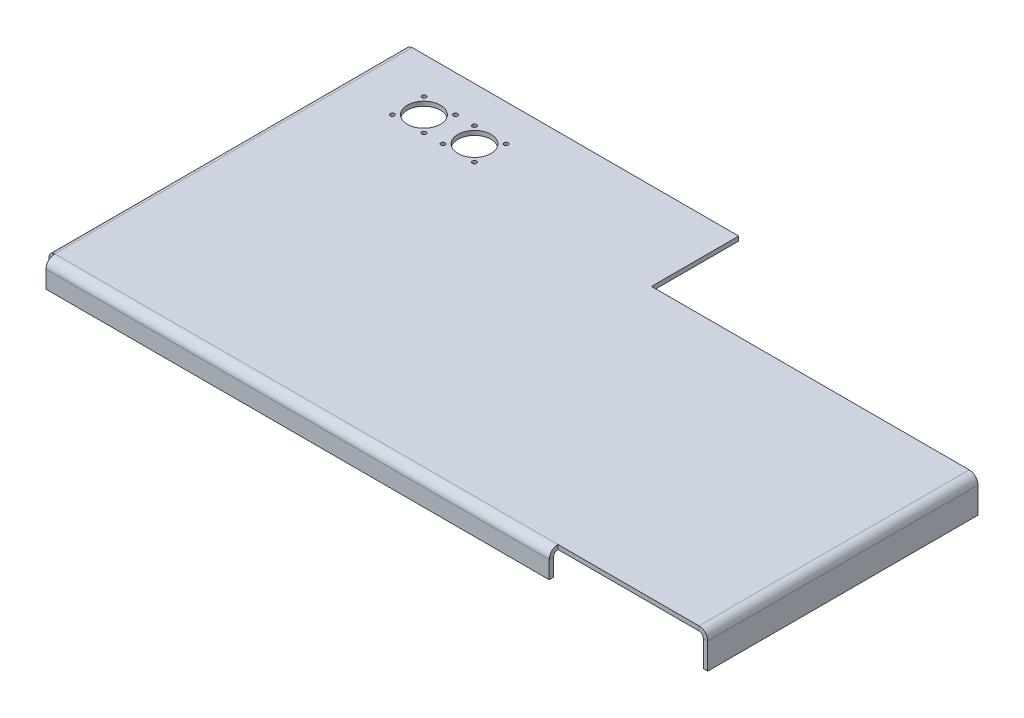
ISO-10303-21;
HEADER;
FILE_DESCRIPTION(('STEP AP214'),'2;1');
FILE_NAME('part.step','',(''),(''),'','','');
FILE_SCHEMA(('AUTOMOTIVE_DESIGN { 1 0 10303 214 1 1 1 1 }'));
ENDSEC;
DATA;
#1=APPLICATION_CONTEXT('core data for automotive mechanical design processes');
#2=APPLICATION_PROTOCOL_DEFINITION('international standard','automotive_design',2000,#1);
#3=PRODUCT_CONTEXT('',#1,'mechanical');
#4=PRODUCT('Part','Part','',(#3));
#5=PRODUCT_RELATED_PRODUCT_CATEGORY('part','',(#4));
#6=PRODUCT_DEFINITION_FORMATION('','',#4);
#7=PRODUCT_DEFINITION_CONTEXT('part definition',#1,'design');
#8=PRODUCT_DEFINITION('design','',#6,#7);
#9=PRODUCT_DEFINITION_SHAPE('','',#8);
#10=(LENGTH_UNIT() NAMED_UNIT(*) SI_UNIT(.MILLI.,.METRE.));
#11=(NAMED_UNIT(*) PLANE_ANGLE_UNIT() SI_UNIT($,.RADIAN.));
#12=(NAMED_UNIT(*) SI_UNIT($,.STERADIAN.) SOLID_ANGLE_UNIT());
#13=UNCERTAINTY_MEASURE_WITH_UNIT(LENGTH_MEASURE(1.E-05),#10,'distance_accuracy_value','');
#14=(GEOMETRIC_REPRESENTATION_CONTEXT(3) GLOBAL_UNCERTAINTY_ASSIGNED_CONTEXT((#13)) GLOBAL_UNIT_ASSIGNED_CONTEXT((#10,
#11,#12)) REPRESENTATION_CONTEXT('',''));
#15=CARTESIAN_POINT('',(0.,0.,0.));
#16=DIRECTION('',(0.,0.,1.));
#17=DIRECTION('',(1.,0.,0.));
#18=AXIS2_PLACEMENT_3D('',#15,#16,#17);
#19=CARTESIAN_POINT('',(0.,-25.4,-66.675));
#20=DIRECTION('',(0.,0.,1.));
#21=DIRECTION('',(1.,0.,0.));
#22=AXIS2_PLACEMENT_3D('',#19,#20,#21);
#23=PLANE('',#22);
#24=DIRECTION('',(0.,1.,0.));
#25=VECTOR('',#24,1.);
#26=CARTESIAN_POINT('',(234.59948,5.93886844464058E-13,-66.675));
#27=LINE('',#26,#25);
#28=CARTESIAN_POINT('',(234.59948,-25.4,-66.675));
#29=VERTEX_POINT('',#28);
#30=CARTESIAN_POINT('',(234.59948,-6.34999999999999,-66.675));
#31=VERTEX_POINT('',#30);
#32=EDGE_CURVE('E249',#29,#31,#27,.T.);
#33=ORIENTED_EDGE('',*,*,#32,.T.);
#34=DIRECTION('',(1.,0.,0.));
#35=VECTOR('',#34,1.);
#36=CARTESIAN_POINT('',(234.59948,-6.34999999999999,-66.675));
#37=LINE('',#36,#35);
#38=CARTESIAN_POINT('',(237.77448,-6.34999999999999,-66.675));
#39=VERTEX_POINT('',#38);
#40=EDGE_CURVE('E13',#31,#39,#37,.T.);
#41=ORIENTED_EDGE('',*,*,#40,.T.);
#42=DIRECTION('',(0.,1.,0.));
#43=VECTOR('',#42,1.);
#44=CARTESIAN_POINT('',(237.77448,6.04972297714885E-13,-66.675));
#45=LINE('',#44,#43);
#46=CARTESIAN_POINT('',(237.77448,-25.4,-66.675));
#47=VERTEX_POINT('',#46);
#48=EDGE_CURVE('E112',#47,#39,#45,.T.);
#49=ORIENTED_EDGE('',*,*,#48,.F.);
#50=DIRECTION('',(1.,0.,0.));
#51=VECTOR('',#50,1.);
#52=CARTESIAN_POINT('',(237.77448,-25.4,-66.675));
#53=LINE('',#52,#51);
#54=EDGE_CURVE('E411',#29,#47,#53,.T.);
#55=ORIENTED_EDGE('',*,*,#54,.F.);
#56=EDGE_LOOP('',(#33,#41,#49,#55));
#57=FACE_BOUND('',#56,.T.);
#58=ADVANCED_FACE('F98',(#57),#23,.F.);
#59=DIRECTION('',(1.,0.,0.));
#60=VECTOR('',#59,1.);
#61=CARTESIAN_POINT('',(0.,0.,-66.675));
#62=LINE('',#61,#60);
#63=CARTESIAN_POINT('',(0.,0.,-66.675));
#64=VERTEX_POINT('',#63);
#65=CARTESIAN_POINT('',(231.42448,0.,-66.675));
#66=VERTEX_POINT('',#65);
#67=EDGE_CURVE('E240',#64,#66,#62,.T.);
#68=ORIENTED_EDGE('',*,*,#67,.T.);
#69=DIRECTION('',(0.,-1.,0.));
#70=VECTOR('',#69,1.);
#71=CARTESIAN_POINT('',(231.42448,0.,-66.675));
#72=LINE('',#71,#70);
#73=CARTESIAN_POINT('',(231.42448,-3.17499999999999,-66.675));
#74=VERTEX_POINT('',#73);
#75=EDGE_CURVE('E106',#66,#74,#72,.T.);
#76=ORIENTED_EDGE('',*,*,#75,.T.);
#77=DIRECTION('',(1.,0.,0.));
#78=VECTOR('',#77,1.);
#79=CARTESIAN_POINT('',(0.,-3.175,-66.675));
#80=LINE('',#79,#78);
#81=CARTESIAN_POINT('',(0.,-3.175,-66.675));
#82=VERTEX_POINT('',#81);
#83=EDGE_CURVE('E248',#82,#74,#80,.T.);
#84=ORIENTED_EDGE('',*,*,#83,.F.);
#85=DIRECTION('',(0.,1.,0.));
#86=VECTOR('',#85,1.);
#87=CARTESIAN_POINT('',(0.,-25.4,-66.675));
#88=LINE('',#87,#86);
#89=EDGE_CURVE('E233',#82,#64,#88,.T.);
#90=ORIENTED_EDGE('',*,*,#89,.T.);
#91=EDGE_LOOP('',(#68,#76,#84,#90));
#92=FACE_BOUND('',#91,.T.);
#93=ADVANCED_FACE('F245',(#92),#23,.F.);
#94=CARTESIAN_POINT('',(-237.77448,-3.175,130.175));
#95=DIRECTION('',(0.,0.,1.));
#96=DIRECTION('',(1.,0.,0.));
#97=AXIS2_PLACEMENT_3D('',#94,#95,#96);
#98=PLANE('',#97);
#99=DIRECTION('',(1.,0.,0.));
#100=VECTOR('',#99,1.);
#101=CARTESIAN_POINT('',(-237.77448,-3.175,130.175));
#102=LINE('',#101,#100);
#103=CARTESIAN_POINT('',(128.70688,-3.175,130.175));
#104=VERTEX_POINT('',#103);
#105=CARTESIAN_POINT('',(231.42448,-3.17499999999999,130.175));
#106=VERTEX_POINT('',#105);
#107=EDGE_CURVE('E397',#104,#106,#102,.T.);
#108=ORIENTED_EDGE('',*,*,#107,.T.);
#109=DIRECTION('',(0.,1.,0.));
#110=VECTOR('',#109,1.);
#111=CARTESIAN_POINT('',(231.42448,-3.17499999999999,130.175));
#112=LINE('',#111,#110);
#113=CARTESIAN_POINT('',(231.42448,0.,130.175));
#114=VERTEX_POINT('',#113);
#115=EDGE_CURVE('E335',#106,#114,#112,.T.);
#116=ORIENTED_EDGE('',*,*,#115,.T.);
#117=DIRECTION('',(1.,0.,0.));
#118=VECTOR('',#117,1.);
#119=CARTESIAN_POINT('',(-237.77448,0.,130.175));
#120=LINE('',#119,#118);
#121=CARTESIAN_POINT('',(128.70688,0.,130.175));
#122=VERTEX_POINT('',#121);
#123=EDGE_CURVE('E406',#122,#114,#120,.T.);
#124=ORIENTED_EDGE('',*,*,#123,.F.);
#125=DIRECTION('',(0.,1.,0.));
#126=VECTOR('',#125,1.);
#127=CARTESIAN_POINT('',(128.70688,-3.17499999999997,130.175));
#128=LINE('',#127,#126);
#129=EDGE_CURVE('E120',#104,#122,#128,.T.);
#130=ORIENTED_EDGE('',*,*,#129,.F.);
#131=EDGE_LOOP('',(#108,#116,#124,#130));
#132=FACE_BOUND('',#131,.T.);
#133=ADVANCED_FACE('F446',(#132),#98,.T.);
#134=CARTESIAN_POINT('',(0.,-3.175,0.));
#135=DIRECTION('',(0.,1.,0.));
#136=DIRECTION('',(0.,0.,1.));
#137=AXIS2_PLACEMENT_3D('',#134,#135,#136);
#138=PLANE('',#137);
#139=CARTESIAN_POINT('',(-179.654811625042,-3.175,-80.5802127053283));
#140=DIRECTION('',(0.,1.,0.));
#141=DIRECTION('',(0.,0.,1.));
#142=AXIS2_PLACEMENT_3D('',#139,#140,#141);
#143=CIRCLE('',#142,1.52400000000001);
#144=CARTESIAN_POINT('',(-179.654811625042,-3.175,-79.0562127053283));
#145=VERTEX_POINT('',#144);
#146=EDGE_CURVE('E241',#145,#145,#143,.T.);
#147=ORIENTED_EDGE('',*,*,#146,.T.);
#148=EDGE_LOOP('',(#147));
#149=FACE_BOUND('',#148,.T.);
#150=CARTESIAN_POINT('',(-202.644148374958,-3.175,-80.5802127053283));
#151=DIRECTION('',(0.,1.,0.));
#152=DIRECTION('',(0.,0.,1.));
#153=AXIS2_PLACEMENT_3D('',#150,#151,#152);
#154=CIRCLE('',#153,1.52400000000001);
#155=CARTESIAN_POINT('',(-202.644148374958,-3.175,-79.0562127053283));
#156=VERTEX_POINT('',#155);
#157=EDGE_CURVE('E926',#156,#156,#154,.T.);
#158=ORIENTED_EDGE('',*,*,#157,.T.);
#159=EDGE_LOOP('',(#158));
#160=FACE_BOUND('',#159,.T.);
#161=CARTESIAN_POINT('',(-179.654811625042,-3.175,-103.569787294672));
#162=DIRECTION('',(0.,1.,0.));
#163=DIRECTION('',(0.,0.,1.));
#164=AXIS2_PLACEMENT_3D('',#161,#162,#163);
#165=CIRCLE('',#164,1.52400000000001);
#166=CARTESIAN_POINT('',(-179.654811625042,-3.175,-102.045787294672));
#167=VERTEX_POINT('',#166);
#168=EDGE_CURVE('E928',#167,#167,#165,.T.);
#169=ORIENTED_EDGE('',*,*,#168,.T.);
#170=EDGE_LOOP('',(#169));
#171=FACE_BOUND('',#170,.T.);
#172=CARTESIAN_POINT('',(-202.644148374958,-3.175,-103.569787294672));
#173=DIRECTION('',(0.,1.,0.));
#174=DIRECTION('',(0.,0.,1.));
#175=AXIS2_PLACEMENT_3D('',#172,#173,#174);
#176=CIRCLE('',#175,1.52400000000001);
#177=CARTESIAN_POINT('',(-202.644148374958,-3.175,-102.045787294672));
#178=VERTEX_POINT('',#177);
#179=EDGE_CURVE('E933',#178,#178,#176,.T.);
#180=ORIENTED_EDGE('',*,*,#179,.T.);
#181=EDGE_LOOP('',(#180));
#182=FACE_BOUND('',#181,.T.);
#183=CARTESIAN_POINT('',(-142.824811625042,-3.175,-103.569787294672));
#184=DIRECTION('',(0.,1.,0.));
#185=DIRECTION('',(0.,0.,1.));
#186=AXIS2_PLACEMENT_3D('',#183,#184,#185);
#187=CIRCLE('',#186,1.52400000000001);
#188=CARTESIAN_POINT('',(-142.824811625042,-3.175,-102.045787294672));
#189=VERTEX_POINT('',#188);
#190=EDGE_CURVE('E936',#189,#189,#187,.T.);
#191=ORIENTED_EDGE('',*,*,#190,.T.);
#192=EDGE_LOOP('',(#191));
#193=FACE_BOUND('',#192,.T.);
#194=CARTESIAN_POINT('',(-165.814148374958,-3.175,-80.5802127053283));
#195=DIRECTION('',(0.,1.,0.));
#196=DIRECTION('',(0.,0.,1.));
#197=AXIS2_PLACEMENT_3D('',#194,#195,#196);
#198=CIRCLE('',#197,1.52400000000001);
#199=CARTESIAN_POINT('',(-165.814148374958,-3.175,-79.0562127053283));
#200=VERTEX_POINT('',#199);
#201=EDGE_CURVE('E939',#200,#200,#198,.T.);
#202=ORIENTED_EDGE('',*,*,#201,.T.);
#203=EDGE_LOOP('',(#202));
#204=FACE_BOUND('',#203,.T.);
#205=CARTESIAN_POINT('',(-154.31948,-3.175,-92.075));
#206=DIRECTION('',(0.,1.,0.));
#207=DIRECTION('',(0.,0.,1.));
#208=AXIS2_PLACEMENT_3D('',#205,#206,#207);
#209=CIRCLE('',#208,12.065);
#210=CARTESIAN_POINT('',(-154.31948,-3.175,-80.01));
#211=VERTEX_POINT('',#210);
#212=EDGE_CURVE('E942',#211,#211,#209,.T.);
#213=ORIENTED_EDGE('',*,*,#212,.T.);
#214=EDGE_LOOP('',(#213));
#215=FACE_BOUND('',#214,.T.);
#216=CARTESIAN_POINT('',(-142.824811625042,-3.175,-80.5802127053283));
#217=DIRECTION('',(0.,1.,0.));
#218=DIRECTION('',(0.,0.,1.));
#219=AXIS2_PLACEMENT_3D('',#216,#217,#218);
#220=CIRCLE('',#219,1.52400000000001);
#221=CARTESIAN_POINT('',(-142.824811625042,-3.175,-79.0562127053283));
#222=VERTEX_POINT('',#221);
#223=EDGE_CURVE('E945',#222,#222,#220,.T.);
#224=ORIENTED_EDGE('',*,*,#223,.T.);
#225=EDGE_LOOP('',(#224));
#226=FACE_BOUND('',#225,.T.);
#227=CARTESIAN_POINT('',(-165.814148374958,-3.175,-103.569787294672));
#228=DIRECTION('',(0.,1.,0.));
#229=DIRECTION('',(0.,0.,1.));
#230=AXIS2_PLACEMENT_3D('',#227,#228,#229);
#231=CIRCLE('',#230,1.52400000000001);
#232=CARTESIAN_POINT('',(-165.814148374958,-3.175,-102.045787294672));
#233=VERTEX_POINT('',#232);
#234=EDGE_CURVE('E948',#233,#233,#231,.T.);
#235=ORIENTED_EDGE('',*,*,#234,.T.);
#236=EDGE_LOOP('',(#235));
#237=FACE_BOUND('',#236,.T.);
#238=CARTESIAN_POINT('',(-191.14948,-3.175,-92.075));
#239=DIRECTION('',(0.,1.,0.));
#240=DIRECTION('',(0.,0.,1.));
#241=AXIS2_PLACEMENT_3D('',#238,#239,#240);
#242=CIRCLE('',#241,12.065);
#243=CARTESIAN_POINT('',(-191.14948,-3.175,-80.01));
#244=VERTEX_POINT('',#243);
#245=EDGE_CURVE('E951',#244,#244,#242,.T.);
#246=ORIENTED_EDGE('',*,*,#245,.T.);
#247=EDGE_LOOP('',(#246));
#248=FACE_BOUND('',#247,.T.);
#249=DIRECTION('',(-1.,0.,0.));
#250=VECTOR('',#249,1.);
#251=CARTESIAN_POINT('',(-237.77448,-3.175,-130.175));
#252=LINE('',#251,#250);
#253=CARTESIAN_POINT('',(0.,-3.175,-130.175));
#254=VERTEX_POINT('',#253);
#255=CARTESIAN_POINT('',(-237.77448,-3.17500000000001,-130.175));
#256=VERTEX_POINT('',#255);
#257=EDGE_CURVE('E392',#254,#256,#252,.T.);
#258=ORIENTED_EDGE('',*,*,#257,.F.);
#259=DIRECTION('',(0.,0.,1.));
#260=VECTOR('',#259,1.);
#261=CARTESIAN_POINT('',(0.,-3.175,0.));
#262=LINE('',#261,#260);
#263=EDGE_CURVE('E268',#254,#82,#262,.T.);
#264=ORIENTED_EDGE('',*,*,#263,.T.);
#265=ORIENTED_EDGE('',*,*,#83,.T.);
#266=DIRECTION('',(0.,0.,1.));
#267=VECTOR('',#266,1.);
#268=CARTESIAN_POINT('',(231.42448,-3.17499999999999,130.175));
#269=LINE('',#268,#267);
#270=EDGE_CURVE('E339',#106,#74,#269,.F.);
#271=ORIENTED_EDGE('',*,*,#270,.F.);
#272=ORIENTED_EDGE('',*,*,#107,.F.);
#273=CARTESIAN_POINT('',(-237.77448,-3.17500000000001,130.175));
#274=VERTEX_POINT('',#273);
#275=EDGE_CURVE('E398',#274,#104,#102,.T.);
#276=ORIENTED_EDGE('',*,*,#275,.F.);
#277=DIRECTION('',(0.,0.,1.));
#278=VECTOR('',#277,1.);
#279=CARTESIAN_POINT('',(-237.77448,-3.175,-130.175));
#280=LINE('',#279,#278);
#281=EDGE_CURVE('E394',#256,#274,#280,.T.);
#282=ORIENTED_EDGE('',*,*,#281,.F.);
#283=EDGE_LOOP('',(#258,#264,#265,#271,#272,#276,#282));
#284=FACE_BOUND('',#283,.T.);
#285=ADVANCED_FACE('F423',(#149,#160,#171,#182,#193,#204,#215,#226,#237,#248,#284),#138,.F.);
#286=CARTESIAN_POINT('',(0.,0.,0.));
#287=DIRECTION('',(0.,1.,0.));
#288=DIRECTION('',(0.,0.,1.));
#289=AXIS2_PLACEMENT_3D('',#286,#287,#288);
#290=PLANE('',#289);
#291=CARTESIAN_POINT('',(-179.654811625042,0.,-80.5802127053283));
#292=DIRECTION('',(0.,-1.,0.));
#293=DIRECTION('',(0.,0.,-1.));
#294=AXIS2_PLACEMENT_3D('',#291,#292,#293);
#295=CIRCLE('',#294,1.52400000000001);
#296=CARTESIAN_POINT('',(-179.654811625042,0.,-82.1042127053283));
#297=VERTEX_POINT('',#296);
#298=EDGE_CURVE('E923',#297,#297,#295,.T.);
#299=ORIENTED_EDGE('',*,*,#298,.T.);
#300=EDGE_LOOP('',(#299));
#301=FACE_BOUND('',#300,.T.);
#302=CARTESIAN_POINT('',(-202.644148374958,0.,-80.5802127053283));
#303=DIRECTION('',(0.,-1.,0.));
#304=DIRECTION('',(0.,0.,-1.));
#305=AXIS2_PLACEMENT_3D('',#302,#303,#304);
#306=CIRCLE('',#305,1.52400000000001);
#307=CARTESIAN_POINT('',(-202.644148374958,0.,-82.1042127053283));
#308=VERTEX_POINT('',#307);
#309=EDGE_CURVE('E976',#308,#308,#306,.T.);
#310=ORIENTED_EDGE('',*,*,#309,.T.);
#311=EDGE_LOOP('',(#310));
#312=FACE_BOUND('',#311,.T.);
#313=CARTESIAN_POINT('',(-179.654811625042,0.,-103.569787294672));
#314=DIRECTION('',(0.,-1.,0.));
#315=DIRECTION('',(0.,0.,1.));
#316=AXIS2_PLACEMENT_3D('',#313,#314,#315);
#317=CIRCLE('',#316,1.52400000000001);
#318=CARTESIAN_POINT('',(-179.654811625042,0.,-102.045787294672));
#319=VERTEX_POINT('',#318);
#320=EDGE_CURVE('E973',#319,#319,#317,.T.);
#321=ORIENTED_EDGE('',*,*,#320,.T.);
#322=EDGE_LOOP('',(#321));
#323=FACE_BOUND('',#322,.T.);
#324=CARTESIAN_POINT('',(-202.644148374958,0.,-103.569787294672));
#325=DIRECTION('',(0.,-1.,0.));
#326=DIRECTION('',(0.,0.,1.));
#327=AXIS2_PLACEMENT_3D('',#324,#325,#326);
#328=CIRCLE('',#327,1.52400000000001);
#329=CARTESIAN_POINT('',(-202.644148374958,0.,-102.045787294672));
#330=VERTEX_POINT('',#329);
#331=EDGE_CURVE('E960',#330,#330,#328,.T.);
#332=ORIENTED_EDGE('',*,*,#331,.T.);
#333=EDGE_LOOP('',(#332));
#334=FACE_BOUND('',#333,.T.);
#335=CARTESIAN_POINT('',(-142.824811625042,0.,-103.569787294672));
#336=DIRECTION('',(0.,-1.,0.));
#337=DIRECTION('',(0.,0.,1.));
#338=AXIS2_PLACEMENT_3D('',#335,#336,#337);
#339=CIRCLE('',#338,1.52400000000001);
#340=CARTESIAN_POINT('',(-142.824811625042,0.,-102.045787294672));
#341=VERTEX_POINT('',#340);
#342=EDGE_CURVE('E965',#341,#341,#339,.T.);
#343=ORIENTED_EDGE('',*,*,#342,.T.);
#344=EDGE_LOOP('',(#343));
#345=FACE_BOUND('',#344,.T.);
#346=CARTESIAN_POINT('',(-165.814148374958,0.,-80.5802127053283));
#347=DIRECTION('',(0.,-1.,0.));
#348=DIRECTION('',(0.,0.,-1.));
#349=AXIS2_PLACEMENT_3D('',#346,#347,#348);
#350=CIRCLE('',#349,1.52400000000001);
#351=CARTESIAN_POINT('',(-165.814148374958,0.,-82.1042127053283));
#352=VERTEX_POINT('',#351);
#353=EDGE_CURVE('E964',#352,#352,#350,.T.);
#354=ORIENTED_EDGE('',*,*,#353,.T.);
#355=EDGE_LOOP('',(#354));
#356=FACE_BOUND('',#355,.T.);
#357=CARTESIAN_POINT('',(-154.31948,0.,-92.075));
#358=DIRECTION('',(0.,-1.,0.));
#359=DIRECTION('',(0.,0.,-1.));
#360=AXIS2_PLACEMENT_3D('',#357,#358,#359);
#361=CIRCLE('',#360,12.065);
#362=CARTESIAN_POINT('',(-154.31948,0.,-104.14));
#363=VERTEX_POINT('',#362);
#364=EDGE_CURVE('E957',#363,#363,#361,.T.);
#365=ORIENTED_EDGE('',*,*,#364,.T.);
#366=EDGE_LOOP('',(#365));
#367=FACE_BOUND('',#366,.T.);
#368=CARTESIAN_POINT('',(-142.824811625042,0.,-80.5802127053283));
#369=DIRECTION('',(0.,-1.,0.));
#370=DIRECTION('',(0.,0.,-1.));
#371=AXIS2_PLACEMENT_3D('',#368,#369,#370);
#372=CIRCLE('',#371,1.52400000000001);
#373=CARTESIAN_POINT('',(-142.824811625042,0.,-82.1042127053283));
#374=VERTEX_POINT('',#373);
#375=EDGE_CURVE('E961',#374,#374,#372,.T.);
#376=ORIENTED_EDGE('',*,*,#375,.T.);
#377=EDGE_LOOP('',(#376));
#378=FACE_BOUND('',#377,.T.);
#379=CARTESIAN_POINT('',(-165.814148374958,0.,-103.569787294672));
#380=DIRECTION('',(0.,-1.,0.));
#381=DIRECTION('',(0.,0.,1.));
#382=AXIS2_PLACEMENT_3D('',#379,#380,#381);
#383=CIRCLE('',#382,1.52400000000001);
#384=CARTESIAN_POINT('',(-165.814148374958,0.,-102.045787294672));
#385=VERTEX_POINT('',#384);
#386=EDGE_CURVE('E968',#385,#385,#383,.T.);
#387=ORIENTED_EDGE('',*,*,#386,.T.);
#388=EDGE_LOOP('',(#387));
#389=FACE_BOUND('',#388,.T.);
#390=CARTESIAN_POINT('',(-191.14948,0.,-92.075));
#391=DIRECTION('',(0.,-1.,0.));
#392=DIRECTION('',(0.,0.,-1.));
#393=AXIS2_PLACEMENT_3D('',#390,#391,#392);
#394=CIRCLE('',#393,12.065);
#395=CARTESIAN_POINT('',(-191.14948,0.,-104.14));
#396=VERTEX_POINT('',#395);
#397=EDGE_CURVE('E954',#396,#396,#394,.T.);
#398=ORIENTED_EDGE('',*,*,#397,.T.);
#399=EDGE_LOOP('',(#398));
#400=FACE_BOUND('',#399,.T.);
#401=DIRECTION('',(0.,0.,1.));
#402=VECTOR('',#401,1.);
#403=CARTESIAN_POINT('',(0.,0.,-242.216944056905));
#404=LINE('',#403,#402);
#405=CARTESIAN_POINT('',(0.,0.,-130.175));
#406=VERTEX_POINT('',#405);
#407=EDGE_CURVE('E230',#406,#64,#404,.T.);
#408=ORIENTED_EDGE('',*,*,#407,.F.);
#409=DIRECTION('',(-1.,0.,0.));
#410=VECTOR('',#409,1.);
#411=CARTESIAN_POINT('',(-237.77448,0.,-130.175));
#412=LINE('',#411,#410);
#413=CARTESIAN_POINT('',(-237.77448,0.,-130.175));
#414=VERTEX_POINT('',#413);
#415=EDGE_CURVE('E391',#406,#414,#412,.T.);
#416=ORIENTED_EDGE('',*,*,#415,.T.);
#417=DIRECTION('',(0.,0.,1.));
#418=VECTOR('',#417,1.);
#419=CARTESIAN_POINT('',(-237.77448,0.,-130.175));
#420=LINE('',#419,#418);
#421=CARTESIAN_POINT('',(-237.77448,0.,130.175));
#422=VERTEX_POINT('',#421);
#423=EDGE_CURVE('E403',#414,#422,#420,.T.);
#424=ORIENTED_EDGE('',*,*,#423,.T.);
#425=EDGE_CURVE('E395',#422,#122,#120,.T.);
#426=ORIENTED_EDGE('',*,*,#425,.T.);
#427=ORIENTED_EDGE('',*,*,#123,.T.);
#428=DIRECTION('',(0.,0.,1.));
#429=VECTOR('',#428,1.);
#430=CARTESIAN_POINT('',(231.42448,0.,130.175));
#431=LINE('',#430,#429);
#432=EDGE_CURVE('E254',#114,#66,#431,.F.);
#433=ORIENTED_EDGE('',*,*,#432,.T.);
#434=ORIENTED_EDGE('',*,*,#67,.F.);
#435=EDGE_LOOP('',(#408,#416,#424,#426,#427,#433,#434));
#436=FACE_BOUND('',#435,.T.);
#437=ADVANCED_FACE('F252',(#301,#312,#323,#334,#345,#356,#367,#378,#389,#400,#436),#290,.T.);
#438=CARTESIAN_POINT('',(-237.77448,-3.175,-130.175));
#439=DIRECTION('',(0.,0.,-1.));
#440=DIRECTION('',(-1.,0.,0.));
#441=AXIS2_PLACEMENT_3D('',#438,#439,#440);
#442=PLANE('',#441);
#443=DIRECTION('',(0.,1.,0.));
#444=VECTOR('',#443,1.);
#445=CARTESIAN_POINT('',(0.,-3.175,-130.175));
#446=LINE('',#445,#444);
#447=EDGE_CURVE('E236',#254,#406,#446,.T.);
#448=ORIENTED_EDGE('',*,*,#447,.F.);
#449=ORIENTED_EDGE('',*,*,#257,.T.);
#450=DIRECTION('',(0.,1.,0.));
#451=VECTOR('',#450,1.);
#452=CARTESIAN_POINT('',(-237.77448,-3.175,-130.175));
#453=LINE('',#452,#451);
#454=EDGE_CURVE('E401',#256,#414,#453,.T.);
#455=ORIENTED_EDGE('',*,*,#454,.T.);
#456=ORIENTED_EDGE('',*,*,#415,.F.);
#457=EDGE_LOOP('',(#448,#449,#455,#456));
#458=FACE_BOUND('',#457,.T.);
#459=ADVANCED_FACE('F100',(#458),#442,.T.);
#460=CARTESIAN_POINT('',(128.70688,-6.34999999999998,130.175));
#461=DIRECTION('',(1.,0.,0.));
#462=DIRECTION('',(0.,0.,-1.));
#463=AXIS2_PLACEMENT_3D('',#460,#461,#462);
#464=PLANE('',#463);
#465=DIRECTION('',(0.,0.,1.));
#466=VECTOR('',#465,1.);
#467=CARTESIAN_POINT('',(128.70688,-6.34999999999999,136.525));
#468=LINE('',#467,#466);
#469=CARTESIAN_POINT('',(128.70688,-6.34999999999997,133.35));
#470=VERTEX_POINT('',#469);
#471=CARTESIAN_POINT('',(128.70688,-6.34999999999996,136.525));
#472=VERTEX_POINT('',#471);
#473=EDGE_CURVE('E346',#470,#472,#468,.T.);
#474=ORIENTED_EDGE('',*,*,#473,.F.);
#475=CARTESIAN_POINT('',(128.70688,-6.34999999999998,130.175));
#476=DIRECTION('',(-1.,0.,0.));
#477=DIRECTION('',(0.,0.,1.));
#478=AXIS2_PLACEMENT_3D('',#475,#476,#477);
#479=CIRCLE('',#478,3.17500000000001);
#480=EDGE_CURVE('E385',#104,#470,#479,.F.);
#481=ORIENTED_EDGE('',*,*,#480,.F.);
#482=ORIENTED_EDGE('',*,*,#129,.T.);
#483=CARTESIAN_POINT('',(128.70688,-6.34999999999998,130.175));
#484=DIRECTION('',(-1.,0.,0.));
#485=DIRECTION('',(0.,0.,1.));
#486=AXIS2_PLACEMENT_3D('',#483,#484,#485);
#487=CIRCLE('',#486,6.35000000000001);
#488=EDGE_CURVE('E379',#122,#472,#487,.F.);
#489=ORIENTED_EDGE('',*,*,#488,.T.);
#490=EDGE_LOOP('',(#474,#481,#482,#489));
#491=FACE_BOUND('',#490,.T.);
#492=ADVANCED_FACE('F474',(#491),#464,.T.);
#493=CARTESIAN_POINT('',(-237.77448,-6.34999999999998,130.175));
#494=DIRECTION('',(1.,0.,0.));
#495=DIRECTION('',(0.,0.,-1.));
#496=AXIS2_PLACEMENT_3D('',#493,#494,#495);
#497=PLANE('',#496);
#498=CARTESIAN_POINT('',(-237.77448,-6.34999999999998,130.175));
#499=DIRECTION('',(-1.,0.,0.));
#500=DIRECTION('',(0.,0.,1.));
#501=AXIS2_PLACEMENT_3D('',#498,#499,#500);
#502=CIRCLE('',#501,3.17500000000001);
#503=CARTESIAN_POINT('',(-237.77448,-6.34999999999997,133.35));
#504=VERTEX_POINT('',#503);
#505=EDGE_CURVE('E349',#504,#274,#502,.T.);
#506=ORIENTED_EDGE('',*,*,#505,.F.);
#507=DIRECTION('',(0.,0.,1.));
#508=VECTOR('',#507,1.);
#509=CARTESIAN_POINT('',(-237.77448,-6.34999999999997,133.35));
#510=LINE('',#509,#508);
#511=CARTESIAN_POINT('',(-237.77448,-6.34999999999997,136.525));
#512=VERTEX_POINT('',#511);
#513=EDGE_CURVE('E372',#504,#512,#510,.T.);
#514=ORIENTED_EDGE('',*,*,#513,.T.);
#515=CARTESIAN_POINT('',(-237.77448,-6.34999999999998,130.175));
#516=DIRECTION('',(-1.,0.,0.));
#517=DIRECTION('',(0.,0.,1.));
#518=AXIS2_PLACEMENT_3D('',#515,#516,#517);
#519=CIRCLE('',#518,6.35000000000001);
#520=EDGE_CURVE('E382',#512,#422,#519,.T.);
#521=ORIENTED_EDGE('',*,*,#520,.T.);
#522=DIRECTION('',(0.,1.,0.));
#523=VECTOR('',#522,1.);
#524=CARTESIAN_POINT('',(-237.77448,-3.175,130.175));
#525=LINE('',#524,#523);
#526=EDGE_CURVE('E408',#274,#422,#525,.T.);
#527=ORIENTED_EDGE('',*,*,#526,.F.);
#528=EDGE_LOOP('',(#506,#514,#521,#527));
#529=FACE_BOUND('',#528,.T.);
#530=ADVANCED_FACE('F455',(#529),#497,.F.);
#531=CARTESIAN_POINT('',(-237.77448,-6.34999999999998,130.175));
#532=DIRECTION('',(-1.,0.,0.));
#533=DIRECTION('',(0.,0.,1.));
#534=AXIS2_PLACEMENT_3D('',#531,#532,#533);
#535=CYLINDRICAL_SURFACE('',#534,6.35000000000001);
#536=ORIENTED_EDGE('',*,*,#425,.F.);
#537=ORIENTED_EDGE('',*,*,#520,.F.);
#538=DIRECTION('',(-1.,0.,0.));
#539=VECTOR('',#538,1.);
#540=CARTESIAN_POINT('',(0.,-6.34999999999999,136.525));
#541=LINE('',#540,#539);
#542=EDGE_CURVE('E369',#472,#512,#541,.T.);
#543=ORIENTED_EDGE('',*,*,#542,.F.);
#544=ORIENTED_EDGE('',*,*,#488,.F.);
#545=EDGE_LOOP('',(#536,#537,#543,#544));
#546=FACE_BOUND('',#545,.T.);
#547=ADVANCED_FACE('F451',(#546),#535,.T.);
#548=CARTESIAN_POINT('',(-237.77448,-6.34999999999998,130.175));
#549=DIRECTION('',(-1.,0.,0.));
#550=DIRECTION('',(0.,0.,1.));
#551=AXIS2_PLACEMENT_3D('',#548,#549,#550);
#552=CYLINDRICAL_SURFACE('',#551,3.17500000000001);
#553=ORIENTED_EDGE('',*,*,#275,.T.);
#554=ORIENTED_EDGE('',*,*,#480,.T.);
#555=DIRECTION('',(1.,0.,0.));
#556=VECTOR('',#555,1.);
#557=CARTESIAN_POINT('',(128.70688,-6.34999999999999,133.35));
#558=LINE('',#557,#556);
#559=EDGE_CURVE('E375',#470,#504,#558,.F.);
#560=ORIENTED_EDGE('',*,*,#559,.T.);
#561=ORIENTED_EDGE('',*,*,#505,.T.);
#562=EDGE_LOOP('',(#553,#554,#560,#561));
#563=FACE_BOUND('',#562,.T.);
#564=ADVANCED_FACE('F477',(#563),#552,.F.);
#565=CARTESIAN_POINT('',(-237.77448,-3.17499999999999,136.525));
#566=DIRECTION('',(-1.,0.,0.));
#567=DIRECTION('',(0.,-1.,0.));
#568=AXIS2_PLACEMENT_3D('',#565,#566,#567);
#569=PLANE('',#568);
#570=DIRECTION('',(0.,1.,0.));
#571=VECTOR('',#570,1.);
#572=CARTESIAN_POINT('',(-237.77448,-3.17499999999999,136.525));
#573=LINE('',#572,#571);
#574=CARTESIAN_POINT('',(-237.77448,-19.05,136.525));
#575=VERTEX_POINT('',#574);
#576=EDGE_CURVE('E353',#575,#512,#573,.T.);
#577=ORIENTED_EDGE('',*,*,#576,.T.);
#578=ORIENTED_EDGE('',*,*,#513,.F.);
#579=DIRECTION('',(0.,-1.,0.));
#580=VECTOR('',#579,1.);
#581=CARTESIAN_POINT('',(-237.77448,-3.76250142153367E-13,133.35));
#582=LINE('',#581,#580);
#583=CARTESIAN_POINT('',(-237.77448,-19.05,133.35));
#584=VERTEX_POINT('',#583);
#585=EDGE_CURVE('E361',#584,#504,#582,.F.);
#586=ORIENTED_EDGE('',*,*,#585,.F.);
#587=DIRECTION('',(0.,0.,-1.));
#588=VECTOR('',#587,1.);
#589=CARTESIAN_POINT('',(-237.77448,-19.05,136.525));
#590=LINE('',#589,#588);
#591=EDGE_CURVE('E347',#575,#584,#590,.T.);
#592=ORIENTED_EDGE('',*,*,#591,.F.);
#593=EDGE_LOOP('',(#577,#578,#586,#592));
#594=FACE_BOUND('',#593,.T.);
#595=ADVANCED_FACE('F464',(#594),#569,.T.);
#596=CARTESIAN_POINT('',(128.70688,-19.05,136.525));
#597=DIRECTION('',(1.,0.,0.));
#598=DIRECTION('',(0.,1.,0.));
#599=AXIS2_PLACEMENT_3D('',#596,#597,#598);
#600=PLANE('',#599);
#601=DIRECTION('',(0.,1.,0.));
#602=VECTOR('',#601,1.);
#603=CARTESIAN_POINT('',(128.70688,1.13027809334198E-12,133.35));
#604=LINE('',#603,#602);
#605=CARTESIAN_POINT('',(128.70688,-19.05,133.35));
#606=VERTEX_POINT('',#605);
#607=EDGE_CURVE('E367',#470,#606,#604,.F.);
#608=ORIENTED_EDGE('',*,*,#607,.F.);
#609=ORIENTED_EDGE('',*,*,#473,.T.);
#610=DIRECTION('',(0.,-1.,0.));
#611=VECTOR('',#610,1.);
#612=CARTESIAN_POINT('',(128.70688,-19.05,136.525));
#613=LINE('',#612,#611);
#614=CARTESIAN_POINT('',(128.70688,-19.05,136.525));
#615=VERTEX_POINT('',#614);
#616=EDGE_CURVE('E359',#472,#615,#613,.T.);
#617=ORIENTED_EDGE('',*,*,#616,.T.);
#618=DIRECTION('',(0.,0.,-1.));
#619=VECTOR('',#618,1.);
#620=CARTESIAN_POINT('',(128.70688,-19.05,136.525));
#621=LINE('',#620,#619);
#622=EDGE_CURVE('E350',#615,#606,#621,.T.);
#623=ORIENTED_EDGE('',*,*,#622,.T.);
#624=EDGE_LOOP('',(#608,#609,#617,#623));
#625=FACE_BOUND('',#624,.T.);
#626=ADVANCED_FACE('F471',(#625),#600,.T.);
#627=CARTESIAN_POINT('',(0.,4.66276893347141E-13,136.525));
#628=DIRECTION('',(0.,0.,1.));
#629=DIRECTION('',(0.,-1.,0.));
#630=AXIS2_PLACEMENT_3D('',#627,#628,#629);
#631=PLANE('',#630);
#632=ORIENTED_EDGE('',*,*,#616,.F.);
#633=ORIENTED_EDGE('',*,*,#542,.T.);
#634=ORIENTED_EDGE('',*,*,#576,.F.);
#635=DIRECTION('',(-1.,0.,0.));
#636=VECTOR('',#635,1.);
#637=CARTESIAN_POINT('',(-237.77448,-19.05,136.525));
#638=LINE('',#637,#636);
#639=EDGE_CURVE('E356',#615,#575,#638,.T.);
#640=ORIENTED_EDGE('',*,*,#639,.F.);
#641=EDGE_LOOP('',(#632,#633,#634,#640));
#642=FACE_BOUND('',#641,.T.);
#643=ADVANCED_FACE('F462',(#642),#631,.T.);
#644=CARTESIAN_POINT('',(0.,4.55191440096314E-13,133.35));
#645=DIRECTION('',(0.,0.,1.));
#646=DIRECTION('',(0.,-1.,0.));
#647=AXIS2_PLACEMENT_3D('',#644,#645,#646);
#648=PLANE('',#647);
#649=ORIENTED_EDGE('',*,*,#559,.F.);
#650=ORIENTED_EDGE('',*,*,#607,.T.);
#651=DIRECTION('',(1.,0.,0.));
#652=VECTOR('',#651,1.);
#653=CARTESIAN_POINT('',(0.,-19.05,133.35));
#654=LINE('',#653,#652);
#655=EDGE_CURVE('E364',#606,#584,#654,.F.);
#656=ORIENTED_EDGE('',*,*,#655,.T.);
#657=ORIENTED_EDGE('',*,*,#585,.T.);
#658=EDGE_LOOP('',(#649,#650,#656,#657));
#659=FACE_BOUND('',#658,.T.);
#660=ADVANCED_FACE('F480',(#659),#648,.F.);
#661=CARTESIAN_POINT('',(-237.77448,-19.05,136.525));
#662=DIRECTION('',(0.,-1.,0.));
#663=DIRECTION('',(0.,0.,-1.));
#664=AXIS2_PLACEMENT_3D('',#661,#662,#663);
#665=PLANE('',#664);
#666=ORIENTED_EDGE('',*,*,#655,.F.);
#667=ORIENTED_EDGE('',*,*,#622,.F.);
#668=ORIENTED_EDGE('',*,*,#639,.T.);
#669=ORIENTED_EDGE('',*,*,#591,.T.);
#670=EDGE_LOOP('',(#666,#667,#668,#669));
#671=FACE_BOUND('',#670,.T.);
#672=ADVANCED_FACE('F468',(#671),#665,.T.);
#673=CARTESIAN_POINT('',(231.42448,-6.35,130.175));
#674=DIRECTION('',(0.,0.,-1.));
#675=DIRECTION('',(-1.,0.,0.));
#676=AXIS2_PLACEMENT_3D('',#673,#674,#675);
#677=PLANE('',#676);
#678=CARTESIAN_POINT('',(231.42448,-6.35,130.175));
#679=DIRECTION('',(0.,0.,1.));
#680=DIRECTION('',(1.,0.,0.));
#681=AXIS2_PLACEMENT_3D('',#678,#679,#680);
#682=CIRCLE('',#681,3.17500000000001);
#683=CARTESIAN_POINT('',(234.59948,-6.34999999999999,130.175));
#684=VERTEX_POINT('',#683);
#685=EDGE_CURVE('E316',#684,#106,#682,.T.);
#686=ORIENTED_EDGE('',*,*,#685,.F.);
#687=DIRECTION('',(-1.,0.,0.));
#688=VECTOR('',#687,1.);
#689=CARTESIAN_POINT('',(234.59948,-6.34999999999999,130.175));
#690=LINE('',#689,#688);
#691=CARTESIAN_POINT('',(237.77448,-6.34999999999999,130.175));
#692=VERTEX_POINT('',#691);
#693=EDGE_CURVE('E330',#684,#692,#690,.F.);
#694=ORIENTED_EDGE('',*,*,#693,.T.);
#695=CARTESIAN_POINT('',(231.42448,-6.35,130.175));
#696=DIRECTION('',(0.,0.,1.));
#697=DIRECTION('',(1.,0.,0.));
#698=AXIS2_PLACEMENT_3D('',#695,#696,#697);
#699=CIRCLE('',#698,6.35000000000001);
#700=EDGE_CURVE('E336',#692,#114,#699,.T.);
#701=ORIENTED_EDGE('',*,*,#700,.T.);
#702=ORIENTED_EDGE('',*,*,#115,.F.);
#703=EDGE_LOOP('',(#686,#694,#701,#702));
#704=FACE_BOUND('',#703,.T.);
#705=ADVANCED_FACE('F428',(#704),#677,.F.);
#706=CARTESIAN_POINT('',(231.42448,-6.35,130.175));
#707=DIRECTION('',(0.,0.,1.));
#708=DIRECTION('',(1.,0.,0.));
#709=AXIS2_PLACEMENT_3D('',#706,#707,#708);
#710=CYLINDRICAL_SURFACE('',#709,6.35000000000001);
#711=CARTESIAN_POINT('',(231.42448,-6.35,-66.675));
#712=DIRECTION('',(0.,0.,1.));
#713=DIRECTION('',(1.,0.,0.));
#714=AXIS2_PLACEMENT_3D('',#711,#712,#713);
#715=CIRCLE('',#714,6.35000000000001);
#716=EDGE_CURVE('E265',#66,#39,#715,.F.);
#717=ORIENTED_EDGE('',*,*,#716,.F.);
#718=ORIENTED_EDGE('',*,*,#432,.F.);
#719=ORIENTED_EDGE('',*,*,#700,.F.);
#720=DIRECTION('',(0.,0.,1.));
#721=VECTOR('',#720,1.);
#722=CARTESIAN_POINT('',(237.77448,-6.34999999999999,-130.175));
#723=LINE('',#722,#721);
#724=EDGE_CURVE('E327',#692,#39,#723,.F.);
#725=ORIENTED_EDGE('',*,*,#724,.T.);
#726=EDGE_LOOP('',(#717,#718,#719,#725));
#727=FACE_BOUND('',#726,.T.);
#728=ADVANCED_FACE('F445',(#727),#710,.T.);
#729=CARTESIAN_POINT('',(231.42448,-6.35,130.175));
#730=DIRECTION('',(0.,0.,1.));
#731=DIRECTION('',(1.,0.,0.));
#732=AXIS2_PLACEMENT_3D('',#729,#730,#731);
#733=CYLINDRICAL_SURFACE('',#732,3.17500000000001);
#734=ORIENTED_EDGE('',*,*,#270,.T.);
#735=CARTESIAN_POINT('',(231.42448,-6.35,-66.675));
#736=DIRECTION('',(0.,0.,1.));
#737=DIRECTION('',(1.,0.,0.));
#738=AXIS2_PLACEMENT_3D('',#735,#736,#737);
#739=CIRCLE('',#738,3.17500000000001);
#740=EDGE_CURVE('E260',#74,#31,#739,.F.);
#741=ORIENTED_EDGE('',*,*,#740,.T.);
#742=DIRECTION('',(0.,0.,1.));
#743=VECTOR('',#742,1.);
#744=CARTESIAN_POINT('',(234.59948,-6.34999999999999,-130.175));
#745=LINE('',#744,#743);
#746=EDGE_CURVE('E304',#31,#684,#745,.T.);
#747=ORIENTED_EDGE('',*,*,#746,.T.);
#748=ORIENTED_EDGE('',*,*,#685,.T.);
#749=EDGE_LOOP('',(#734,#741,#747,#748));
#750=FACE_BOUND('',#749,.T.);
#751=ADVANCED_FACE('F424',(#750),#733,.F.);
#752=CARTESIAN_POINT('',(237.77448,-25.4,130.175));
#753=DIRECTION('',(0.,0.,-1.));
#754=DIRECTION('',(0.,1.,0.));
#755=AXIS2_PLACEMENT_3D('',#752,#753,#754);
#756=PLANE('',#755);
#757=ORIENTED_EDGE('',*,*,#693,.F.);
#758=DIRECTION('',(0.,1.,0.));
#759=VECTOR('',#758,1.);
#760=CARTESIAN_POINT('',(234.59948,-25.4,130.175));
#761=LINE('',#760,#759);
#762=CARTESIAN_POINT('',(234.59948,-25.4,130.175));
#763=VERTEX_POINT('',#762);
#764=EDGE_CURVE('E325',#684,#763,#761,.F.);
#765=ORIENTED_EDGE('',*,*,#764,.T.);
#766=DIRECTION('',(-1.,0.,0.));
#767=VECTOR('',#766,1.);
#768=CARTESIAN_POINT('',(237.77448,-25.4,130.175));
#769=LINE('',#768,#767);
#770=CARTESIAN_POINT('',(237.77448,-25.4,130.175));
#771=VERTEX_POINT('',#770);
#772=EDGE_CURVE('E313',#771,#763,#769,.T.);
#773=ORIENTED_EDGE('',*,*,#772,.F.);
#774=DIRECTION('',(0.,-1.,0.));
#775=VECTOR('',#774,1.);
#776=CARTESIAN_POINT('',(237.77448,4.42403926251916E-13,130.175));
#777=LINE('',#776,#775);
#778=EDGE_CURVE('E320',#692,#771,#777,.T.);
#779=ORIENTED_EDGE('',*,*,#778,.F.);
#780=EDGE_LOOP('',(#757,#765,#773,#779));
#781=FACE_BOUND('',#780,.T.);
#782=ADVANCED_FACE('F433',(#781),#756,.F.);
#783=CARTESIAN_POINT('',(237.77448,6.04972297714885E-13,0.));
#784=DIRECTION('',(-1.,0.,0.));
#785=DIRECTION('',(0.,-1.,0.));
#786=AXIS2_PLACEMENT_3D('',#783,#784,#785);
#787=PLANE('',#786);
#788=DIRECTION('',(0.,0.,-1.));
#789=VECTOR('',#788,1.);
#790=CARTESIAN_POINT('',(237.77448,-25.4,0.));
#791=LINE('',#790,#789);
#792=EDGE_CURVE('E317',#771,#47,#791,.T.);
#793=ORIENTED_EDGE('',*,*,#792,.T.);
#794=ORIENTED_EDGE('',*,*,#48,.T.);
#795=ORIENTED_EDGE('',*,*,#724,.F.);
#796=ORIENTED_EDGE('',*,*,#778,.T.);
#797=EDGE_LOOP('',(#793,#794,#795,#796));
#798=FACE_BOUND('',#797,.T.);
#799=ADVANCED_FACE('F443',(#798),#787,.F.);
#800=CARTESIAN_POINT('',(234.59948,5.93886844464058E-13,0.));
#801=DIRECTION('',(-1.,0.,0.));
#802=DIRECTION('',(0.,-1.,0.));
#803=AXIS2_PLACEMENT_3D('',#800,#801,#802);
#804=PLANE('',#803);
#805=ORIENTED_EDGE('',*,*,#32,.F.);
#806=DIRECTION('',(0.,0.,1.));
#807=VECTOR('',#806,1.);
#808=CARTESIAN_POINT('',(234.59948,-25.4,-130.175));
#809=LINE('',#808,#807);
#810=EDGE_CURVE('E322',#763,#29,#809,.F.);
#811=ORIENTED_EDGE('',*,*,#810,.F.);
#812=ORIENTED_EDGE('',*,*,#764,.F.);
#813=ORIENTED_EDGE('',*,*,#746,.F.);
#814=EDGE_LOOP('',(#805,#811,#812,#813));
#815=FACE_BOUND('',#814,.T.);
#816=ADVANCED_FACE('F438',(#815),#804,.T.);
#817=CARTESIAN_POINT('',(237.77448,-25.4,-130.175));
#818=DIRECTION('',(0.,1.,0.));
#819=DIRECTION('',(-1.,0.,0.));
#820=AXIS2_PLACEMENT_3D('',#817,#818,#819);
#821=PLANE('',#820);
#822=ORIENTED_EDGE('',*,*,#810,.T.);
#823=ORIENTED_EDGE('',*,*,#54,.T.);
#824=ORIENTED_EDGE('',*,*,#792,.F.);
#825=ORIENTED_EDGE('',*,*,#772,.T.);
#826=EDGE_LOOP('',(#822,#823,#824,#825));
#827=FACE_BOUND('',#826,.T.);
#828=ADVANCED_FACE('F440',(#827),#821,.F.);
#829=CARTESIAN_POINT('',(-237.77448,-4.17500000000001,130.175));
#830=DIRECTION('',(0.,0.,1.));
#831=DIRECTION('',(1.,0.,0.));
#832=AXIS2_PLACEMENT_3D('',#829,#830,#831);
#833=PLANE('',#832);
#834=DIRECTION('',(1.,0.,0.));
#835=VECTOR('',#834,1.);
#836=CARTESIAN_POINT('',(-241.94948,-4.175,130.175));
#837=LINE('',#836,#835);
#838=CARTESIAN_POINT('',(-238.77448,-4.17500000000001,130.175));
#839=VERTEX_POINT('',#838);
#840=CARTESIAN_POINT('',(-241.94948,-4.175,130.175));
#841=VERTEX_POINT('',#840);
#842=EDGE_CURVE('E270',#839,#841,#837,.F.);
#843=ORIENTED_EDGE('',*,*,#842,.F.);
#844=CARTESIAN_POINT('',(-237.77448,-4.17500000000001,130.175));
#845=DIRECTION('',(0.,0.,-1.));
#846=DIRECTION('',(-1.,0.,0.));
#847=AXIS2_PLACEMENT_3D('',#844,#845,#846);
#848=CIRCLE('',#847,1.);
#849=EDGE_CURVE('E308',#274,#839,#848,.F.);
#850=ORIENTED_EDGE('',*,*,#849,.F.);
#851=ORIENTED_EDGE('',*,*,#526,.T.);
#852=CARTESIAN_POINT('',(-237.77448,-4.17500000000001,130.175));
#853=DIRECTION('',(0.,0.,-1.));
#854=DIRECTION('',(-1.,0.,0.));
#855=AXIS2_PLACEMENT_3D('',#852,#853,#854);
#856=CIRCLE('',#855,4.175);
#857=EDGE_CURVE('E301',#422,#841,#856,.F.);
#858=ORIENTED_EDGE('',*,*,#857,.T.);
#859=EDGE_LOOP('',(#843,#850,#851,#858));
#860=FACE_BOUND('',#859,.T.);
#861=ADVANCED_FACE('F537',(#860),#833,.T.);
#862=CARTESIAN_POINT('',(-237.77448,-4.17500000000001,-130.175));
#863=DIRECTION('',(0.,0.,1.));
#864=DIRECTION('',(1.,0.,0.));
#865=AXIS2_PLACEMENT_3D('',#862,#863,#864);
#866=PLANE('',#865);
#867=CARTESIAN_POINT('',(-237.77448,-4.17500000000001,-130.175));
#868=DIRECTION('',(0.,0.,-1.));
#869=DIRECTION('',(-1.,0.,0.));
#870=AXIS2_PLACEMENT_3D('',#867,#868,#869);
#871=CIRCLE('',#870,1.);
#872=CARTESIAN_POINT('',(-238.77448,-4.17500000000001,-130.175));
#873=VERTEX_POINT('',#872);
#874=EDGE_CURVE('E274',#873,#256,#871,.T.);
#875=ORIENTED_EDGE('',*,*,#874,.F.);
#876=DIRECTION('',(1.,0.,0.));
#877=VECTOR('',#876,1.);
#878=CARTESIAN_POINT('',(-238.77448,-4.17500000000001,-130.175));
#879=LINE('',#878,#877);
#880=CARTESIAN_POINT('',(-241.94948,-4.175,-130.175));
#881=VERTEX_POINT('',#880);
#882=EDGE_CURVE('E294',#873,#881,#879,.F.);
#883=ORIENTED_EDGE('',*,*,#882,.T.);
#884=CARTESIAN_POINT('',(-237.77448,-4.17500000000001,-130.175));
#885=DIRECTION('',(0.,0.,-1.));
#886=DIRECTION('',(-1.,0.,0.));
#887=AXIS2_PLACEMENT_3D('',#884,#885,#886);
#888=CIRCLE('',#887,4.175);
#889=EDGE_CURVE('E305',#881,#414,#888,.T.);
#890=ORIENTED_EDGE('',*,*,#889,.T.);
#891=ORIENTED_EDGE('',*,*,#454,.F.);
#892=EDGE_LOOP('',(#875,#883,#890,#891));
#893=FACE_BOUND('',#892,.T.);
#894=ADVANCED_FACE('F532',(#893),#866,.F.);
#895=CARTESIAN_POINT('',(-237.77448,-4.17500000000001,-130.175));
#896=DIRECTION('',(0.,0.,-1.));
#897=DIRECTION('',(-1.,0.,0.));
#898=AXIS2_PLACEMENT_3D('',#895,#896,#897);
#899=CYLINDRICAL_SURFACE('',#898,4.175);
#900=ORIENTED_EDGE('',*,*,#423,.F.);
#901=ORIENTED_EDGE('',*,*,#889,.F.);
#902=DIRECTION('',(0.,0.,-1.));
#903=VECTOR('',#902,1.);
#904=CARTESIAN_POINT('',(-241.94948,-4.175,130.175));
#905=LINE('',#904,#903);
#906=EDGE_CURVE('E292',#881,#841,#905,.F.);
#907=ORIENTED_EDGE('',*,*,#906,.T.);
#908=ORIENTED_EDGE('',*,*,#857,.F.);
#909=EDGE_LOOP('',(#900,#901,#907,#908));
#910=FACE_BOUND('',#909,.T.);
#911=ADVANCED_FACE('F529',(#910),#899,.T.);
#912=CARTESIAN_POINT('',(-237.77448,-4.17500000000001,-130.175));
#913=DIRECTION('',(0.,0.,-1.));
#914=DIRECTION('',(-1.,0.,0.));
#915=AXIS2_PLACEMENT_3D('',#912,#913,#914);
#916=CYLINDRICAL_SURFACE('',#915,1.);
#917=ORIENTED_EDGE('',*,*,#281,.T.);
#918=ORIENTED_EDGE('',*,*,#849,.T.);
#919=DIRECTION('',(0.,0.,-1.));
#920=VECTOR('',#919,1.);
#921=CARTESIAN_POINT('',(-238.77448,-4.17500000000001,130.175));
#922=LINE('',#921,#920);
#923=EDGE_CURVE('E297',#839,#873,#922,.T.);
#924=ORIENTED_EDGE('',*,*,#923,.T.);
#925=ORIENTED_EDGE('',*,*,#874,.T.);
#926=EDGE_LOOP('',(#917,#918,#924,#925));
#927=FACE_BOUND('',#926,.T.);
#928=ADVANCED_FACE('F527',(#927),#916,.F.);
#929=CARTESIAN_POINT('',(-241.94948,-25.4,-130.175));
#930=DIRECTION('',(0.,0.,1.));
#931=DIRECTION('',(0.,-1.,0.));
#932=AXIS2_PLACEMENT_3D('',#929,#930,#931);
#933=PLANE('',#932);
#934=ORIENTED_EDGE('',*,*,#882,.F.);
#935=DIRECTION('',(0.,1.,0.));
#936=VECTOR('',#935,1.);
#937=CARTESIAN_POINT('',(-238.77448,-25.4,-130.175));
#938=LINE('',#937,#936);
#939=CARTESIAN_POINT('',(-238.77448,-25.4,-130.175));
#940=VERTEX_POINT('',#939);
#941=EDGE_CURVE('E290',#873,#940,#938,.F.);
#942=ORIENTED_EDGE('',*,*,#941,.T.);
#943=DIRECTION('',(1.,0.,0.));
#944=VECTOR('',#943,1.);
#945=CARTESIAN_POINT('',(-241.94948,-25.4,-130.175));
#946=LINE('',#945,#944);
#947=CARTESIAN_POINT('',(-241.94948,-25.4,-130.175));
#948=VERTEX_POINT('',#947);
#949=EDGE_CURVE('E271',#948,#940,#946,.T.);
#950=ORIENTED_EDGE('',*,*,#949,.F.);
#951=DIRECTION('',(0.,-1.,0.));
#952=VECTOR('',#951,1.);
#953=CARTESIAN_POINT('',(-241.94948,7.67540669177854E-13,-130.175));
#954=LINE('',#953,#952);
#955=EDGE_CURVE('E283',#881,#948,#954,.T.);
#956=ORIENTED_EDGE('',*,*,#955,.F.);
#957=EDGE_LOOP('',(#934,#942,#950,#956));
#958=FACE_BOUND('',#957,.T.);
#959=ADVANCED_FACE('F522',(#958),#933,.F.);
#960=CARTESIAN_POINT('',(-241.94948,-3.17499999999999,130.175));
#961=DIRECTION('',(0.,0.,-1.));
#962=DIRECTION('',(-1.,0.,0.));
#963=AXIS2_PLACEMENT_3D('',#960,#961,#962);
#964=PLANE('',#963);
#965=ORIENTED_EDGE('',*,*,#842,.T.);
#966=DIRECTION('',(0.,1.,0.));
#967=VECTOR('',#966,1.);
#968=CARTESIAN_POINT('',(-241.94948,6.04972297714885E-13,130.175));
#969=LINE('',#968,#967);
#970=CARTESIAN_POINT('',(-241.94948,-25.4,130.175));
#971=VERTEX_POINT('',#970);
#972=EDGE_CURVE('E278',#971,#841,#969,.T.);
#973=ORIENTED_EDGE('',*,*,#972,.F.);
#974=DIRECTION('',(1.,0.,0.));
#975=VECTOR('',#974,1.);
#976=CARTESIAN_POINT('',(-241.94948,-25.4,130.175));
#977=LINE('',#976,#975);
#978=CARTESIAN_POINT('',(-238.77448,-25.4,130.175));
#979=VERTEX_POINT('',#978);
#980=EDGE_CURVE('E275',#971,#979,#977,.T.);
#981=ORIENTED_EDGE('',*,*,#980,.T.);
#982=DIRECTION('',(0.,-1.,0.));
#983=VECTOR('',#982,1.);
#984=CARTESIAN_POINT('',(-238.77448,-3.175,130.175));
#985=LINE('',#984,#983);
#986=EDGE_CURVE('E285',#979,#839,#985,.F.);
#987=ORIENTED_EDGE('',*,*,#986,.T.);
#988=EDGE_LOOP('',(#965,#973,#981,#987));
#989=FACE_BOUND('',#988,.T.);
#990=ADVANCED_FACE('F516',(#989),#964,.F.);
#991=CARTESIAN_POINT('',(-241.94948,6.04972297714885E-13,0.));
#992=DIRECTION('',(1.,0.,0.));
#993=DIRECTION('',(0.,1.,0.));
#994=AXIS2_PLACEMENT_3D('',#991,#992,#993);
#995=PLANE('',#994);
#996=ORIENTED_EDGE('',*,*,#906,.F.);
#997=ORIENTED_EDGE('',*,*,#955,.T.);
#998=DIRECTION('',(0.,0.,1.));
#999=VECTOR('',#998,1.);
#1000=CARTESIAN_POINT('',(-241.94948,-25.4,0.));
#1001=LINE('',#1000,#999);
#1002=EDGE_CURVE('E281',#948,#971,#1001,.T.);
#1003=ORIENTED_EDGE('',*,*,#1002,.T.);
#1004=ORIENTED_EDGE('',*,*,#972,.T.);
#1005=EDGE_LOOP('',(#996,#997,#1003,#1004));
#1006=FACE_BOUND('',#1005,.T.);
#1007=ADVANCED_FACE('F513',(#1006),#995,.F.);
#1008=CARTESIAN_POINT('',(-238.77448,5.93886844464058E-13,0.));
#1009=DIRECTION('',(1.,0.,0.));
#1010=DIRECTION('',(0.,1.,0.));
#1011=AXIS2_PLACEMENT_3D('',#1008,#1009,#1010);
#1012=PLANE('',#1011);
#1013=ORIENTED_EDGE('',*,*,#941,.F.);
#1014=ORIENTED_EDGE('',*,*,#923,.F.);
#1015=ORIENTED_EDGE('',*,*,#986,.F.);
#1016=DIRECTION('',(0.,0.,-1.));
#1017=VECTOR('',#1016,1.);
#1018=CARTESIAN_POINT('',(-238.77448,-25.4,130.175));
#1019=LINE('',#1018,#1017);
#1020=EDGE_CURVE('E288',#940,#979,#1019,.F.);
#1021=ORIENTED_EDGE('',*,*,#1020,.F.);
#1022=EDGE_LOOP('',(#1013,#1014,#1015,#1021));
#1023=FACE_BOUND('',#1022,.T.);
#1024=ADVANCED_FACE('F509',(#1023),#1012,.T.);
#1025=CARTESIAN_POINT('',(-241.94948,-25.4,130.175));
#1026=DIRECTION('',(0.,1.,0.));
#1027=DIRECTION('',(-1.,0.,0.));
#1028=AXIS2_PLACEMENT_3D('',#1025,#1026,#1027);
#1029=PLANE('',#1028);
#1030=ORIENTED_EDGE('',*,*,#1020,.T.);
#1031=ORIENTED_EDGE('',*,*,#980,.F.);
#1032=ORIENTED_EDGE('',*,*,#1002,.F.);
#1033=ORIENTED_EDGE('',*,*,#949,.T.);
#1034=EDGE_LOOP('',(#1030,#1031,#1032,#1033));
#1035=FACE_BOUND('',#1034,.T.);
#1036=ADVANCED_FACE('F505',(#1035),#1029,.F.);
#1037=CARTESIAN_POINT('',(0.,-25.4,-242.216944056905));
#1038=DIRECTION('',(-1.,0.,0.));
#1039=DIRECTION('',(0.,0.,1.));
#1040=AXIS2_PLACEMENT_3D('',#1037,#1038,#1039);
#1041=PLANE('',#1040);
#1042=ORIENTED_EDGE('',*,*,#447,.T.);
#1043=ORIENTED_EDGE('',*,*,#407,.T.);
#1044=ORIENTED_EDGE('',*,*,#89,.F.);
#1045=ORIENTED_EDGE('',*,*,#263,.F.);
#1046=EDGE_LOOP('',(#1042,#1043,#1044,#1045));
#1047=FACE_BOUND('',#1046,.T.);
#1048=ADVANCED_FACE('F232',(#1047),#1041,.F.);
#1049=ORIENTED_EDGE('',*,*,#40,.F.);
#1050=ORIENTED_EDGE('',*,*,#740,.F.);
#1051=ORIENTED_EDGE('',*,*,#75,.F.);
#1052=ORIENTED_EDGE('',*,*,#716,.T.);
#1053=EDGE_LOOP('',(#1049,#1050,#1051,#1052));
#1054=FACE_BOUND('',#1053,.T.);
#1055=ADVANCED_FACE('F417',(#1054),#23,.F.);
#1056=CARTESIAN_POINT('',(-191.14948,0.,-92.075));
#1057=DIRECTION('',(0.,-1.,0.));
#1058=DIRECTION('',(0.,0.,-1.));
#1059=AXIS2_PLACEMENT_3D('',#1056,#1057,#1058);
#1060=CYLINDRICAL_SURFACE('',#1059,12.065);
#1061=ORIENTED_EDGE('',*,*,#397,.F.);
#1062=EDGE_LOOP('',(#1061));
#1063=FACE_BOUND('',#1062,.T.);
#1064=ORIENTED_EDGE('',*,*,#245,.F.);
#1065=EDGE_LOOP('',(#1064));
#1066=FACE_BOUND('',#1065,.T.);
#1067=ADVANCED_FACE('F498',(#1063,#1066),#1060,.F.);
#1068=CARTESIAN_POINT('',(-165.814148374958,0.,-103.569787294672));
#1069=DIRECTION('',(0.,-1.,0.));
#1070=DIRECTION('',(0.,0.,-1.));
#1071=AXIS2_PLACEMENT_3D('',#1068,#1069,#1070);
#1072=CYLINDRICAL_SURFACE('',#1071,1.52400000000001);
#1073=ORIENTED_EDGE('',*,*,#386,.F.);
#1074=EDGE_LOOP('',(#1073));
#1075=FACE_BOUND('',#1074,.T.);
#1076=ORIENTED_EDGE('',*,*,#234,.F.);
#1077=EDGE_LOOP('',(#1076));
#1078=FACE_BOUND('',#1077,.T.);
#1079=ADVANCED_FACE('F503',(#1075,#1078),#1072,.F.);
#1080=CARTESIAN_POINT('',(-142.824811625042,0.,-80.5802127053283));
#1081=DIRECTION('',(0.,-1.,0.));
#1082=DIRECTION('',(0.,0.,-1.));
#1083=AXIS2_PLACEMENT_3D('',#1080,#1081,#1082);
#1084=CYLINDRICAL_SURFACE('',#1083,1.52400000000001);
#1085=ORIENTED_EDGE('',*,*,#375,.F.);
#1086=EDGE_LOOP('',(#1085));
#1087=FACE_BOUND('',#1086,.T.);
#1088=ORIENTED_EDGE('',*,*,#223,.F.);
#1089=EDGE_LOOP('',(#1088));
#1090=FACE_BOUND('',#1089,.T.);
#1091=ADVANCED_FACE('F740',(#1087,#1090),#1084,.F.);
#1092=CARTESIAN_POINT('',(-154.31948,0.,-92.075));
#1093=DIRECTION('',(0.,-1.,0.));
#1094=DIRECTION('',(0.,0.,-1.));
#1095=AXIS2_PLACEMENT_3D('',#1092,#1093,#1094);
#1096=CYLINDRICAL_SURFACE('',#1095,12.065);
#1097=ORIENTED_EDGE('',*,*,#364,.F.);
#1098=EDGE_LOOP('',(#1097));
#1099=FACE_BOUND('',#1098,.T.);
#1100=ORIENTED_EDGE('',*,*,#212,.F.);
#1101=EDGE_LOOP('',(#1100));
#1102=FACE_BOUND('',#1101,.T.);
#1103=ADVANCED_FACE('F751',(#1099,#1102),#1096,.F.);
#1104=CARTESIAN_POINT('',(-165.814148374958,0.,-80.5802127053283));
#1105=DIRECTION('',(0.,-1.,0.));
#1106=DIRECTION('',(0.,0.,-1.));
#1107=AXIS2_PLACEMENT_3D('',#1104,#1105,#1106);
#1108=CYLINDRICAL_SURFACE('',#1107,1.52400000000001);
#1109=ORIENTED_EDGE('',*,*,#353,.F.);
#1110=EDGE_LOOP('',(#1109));
#1111=FACE_BOUND('',#1110,.T.);
#1112=ORIENTED_EDGE('',*,*,#201,.F.);
#1113=EDGE_LOOP('',(#1112));
#1114=FACE_BOUND('',#1113,.T.);
#1115=ADVANCED_FACE('F762',(#1111,#1114),#1108,.F.);
#1116=CARTESIAN_POINT('',(-142.824811625042,0.,-103.569787294672));
#1117=DIRECTION('',(0.,-1.,0.));
#1118=DIRECTION('',(0.,0.,-1.));
#1119=AXIS2_PLACEMENT_3D('',#1116,#1117,#1118);
#1120=CYLINDRICAL_SURFACE('',#1119,1.52400000000001);
#1121=ORIENTED_EDGE('',*,*,#342,.F.);
#1122=EDGE_LOOP('',(#1121));
#1123=FACE_BOUND('',#1122,.T.);
#1124=ORIENTED_EDGE('',*,*,#190,.F.);
#1125=EDGE_LOOP('',(#1124));
#1126=FACE_BOUND('',#1125,.T.);
#1127=ADVANCED_FACE('F773',(#1123,#1126),#1120,.F.);
#1128=CARTESIAN_POINT('',(-202.644148374958,0.,-103.569787294672));
#1129=DIRECTION('',(0.,-1.,0.));
#1130=DIRECTION('',(0.,0.,-1.));
#1131=AXIS2_PLACEMENT_3D('',#1128,#1129,#1130);
#1132=CYLINDRICAL_SURFACE('',#1131,1.52400000000001);
#1133=ORIENTED_EDGE('',*,*,#331,.F.);
#1134=EDGE_LOOP('',(#1133));
#1135=FACE_BOUND('',#1134,.T.);
#1136=ORIENTED_EDGE('',*,*,#179,.F.);
#1137=EDGE_LOOP('',(#1136));
#1138=FACE_BOUND('',#1137,.T.);
#1139=ADVANCED_FACE('F784',(#1135,#1138),#1132,.F.);
#1140=CARTESIAN_POINT('',(-179.654811625042,0.,-103.569787294672));
#1141=DIRECTION('',(0.,-1.,0.));
#1142=DIRECTION('',(0.,0.,-1.));
#1143=AXIS2_PLACEMENT_3D('',#1140,#1141,#1142);
#1144=CYLINDRICAL_SURFACE('',#1143,1.52400000000001);
#1145=ORIENTED_EDGE('',*,*,#320,.F.);
#1146=EDGE_LOOP('',(#1145));
#1147=FACE_BOUND('',#1146,.T.);
#1148=ORIENTED_EDGE('',*,*,#168,.F.);
#1149=EDGE_LOOP('',(#1148));
#1150=FACE_BOUND('',#1149,.T.);
#1151=ADVANCED_FACE('F795',(#1147,#1150),#1144,.F.);
#1152=CARTESIAN_POINT('',(-202.644148374958,0.,-80.5802127053283));
#1153=DIRECTION('',(0.,-1.,0.));
#1154=DIRECTION('',(0.,0.,-1.));
#1155=AXIS2_PLACEMENT_3D('',#1152,#1153,#1154);
#1156=CYLINDRICAL_SURFACE('',#1155,1.52400000000001);
#1157=ORIENTED_EDGE('',*,*,#309,.F.);
#1158=EDGE_LOOP('',(#1157));
#1159=FACE_BOUND('',#1158,.T.);
#1160=ORIENTED_EDGE('',*,*,#157,.F.);
#1161=EDGE_LOOP('',(#1160));
#1162=FACE_BOUND('',#1161,.T.);
#1163=ADVANCED_FACE('F806',(#1159,#1162),#1156,.F.);
#1164=CARTESIAN_POINT('',(-179.654811625042,0.,-80.5802127053283));
#1165=DIRECTION('',(0.,-1.,0.));
#1166=DIRECTION('',(0.,0.,-1.));
#1167=AXIS2_PLACEMENT_3D('',#1164,#1165,#1166);
#1168=CYLINDRICAL_SURFACE('',#1167,1.52400000000001);
#1169=ORIENTED_EDGE('',*,*,#298,.F.);
#1170=EDGE_LOOP('',(#1169));
#1171=FACE_BOUND('',#1170,.T.);
#1172=ORIENTED_EDGE('',*,*,#146,.F.);
#1173=EDGE_LOOP('',(#1172));
#1174=FACE_BOUND('',#1173,.T.);
#1175=ADVANCED_FACE('F817',(#1171,#1174),#1168,.F.);
#1176=CLOSED_SHELL('',(#58,#93,#133,#285,#437,#459,#492,#530,#547,#564,#595,#626,#643,#660,#672,
#705,#728,#751,#782,#799,#816,#828,#861,#894,#911,#928,#959,#990,#1007,#1024,#1036,#1048,#1055,
#1067,#1079,#1091,#1103,#1115,#1127,#1139,#1151,#1163,#1175));
#1177=MANIFOLD_SOLID_BREP('B2',#1176);
#1178=ADVANCED_BREP_SHAPE_REPRESENTATION('',(#18,#1177),#14);
#1179=SHAPE_DEFINITION_REPRESENTATION(#9,#1178);
ENDSEC;
END-ISO-10303-21;
